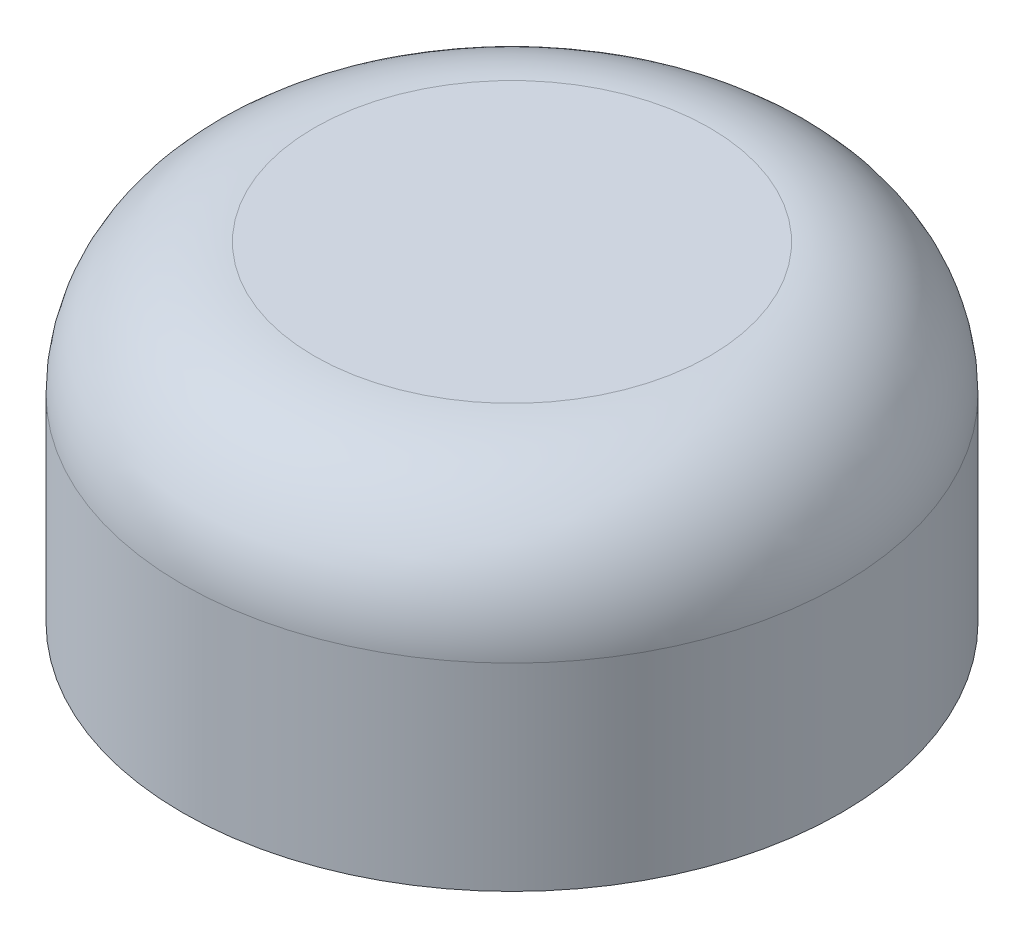
ISO-10303-21;
HEADER;
FILE_DESCRIPTION(('STEP AP214'),'2;1');
FILE_NAME('part.step','',(''),(''),'','','');
FILE_SCHEMA(('AUTOMOTIVE_DESIGN { 1 0 10303 214 1 1 1 1 }'));
ENDSEC;
DATA;
#1=APPLICATION_CONTEXT('core data for automotive mechanical design processes');
#2=APPLICATION_PROTOCOL_DEFINITION('international standard','automotive_design',2000,#1);
#3=PRODUCT_CONTEXT('',#1,'mechanical');
#4=PRODUCT('Part','Part','',(#3));
#5=PRODUCT_RELATED_PRODUCT_CATEGORY('part','',(#4));
#6=PRODUCT_DEFINITION_FORMATION('','',#4);
#7=PRODUCT_DEFINITION_CONTEXT('part definition',#1,'design');
#8=PRODUCT_DEFINITION('design','',#6,#7);
#9=PRODUCT_DEFINITION_SHAPE('','',#8);
#10=(LENGTH_UNIT() NAMED_UNIT(*) SI_UNIT(.MILLI.,.METRE.));
#11=(NAMED_UNIT(*) PLANE_ANGLE_UNIT() SI_UNIT($,.RADIAN.));
#12=(NAMED_UNIT(*) SI_UNIT($,.STERADIAN.) SOLID_ANGLE_UNIT());
#13=UNCERTAINTY_MEASURE_WITH_UNIT(LENGTH_MEASURE(1.E-05),#10,'distance_accuracy_value','');
#14=(GEOMETRIC_REPRESENTATION_CONTEXT(3) GLOBAL_UNCERTAINTY_ASSIGNED_CONTEXT((#13)) GLOBAL_UNIT_ASSIGNED_CONTEXT((#10,
#11,#12)) REPRESENTATION_CONTEXT('',''));
#15=CARTESIAN_POINT('',(0.,0.,0.));
#16=DIRECTION('',(0.,0.,1.));
#17=DIRECTION('',(1.,0.,0.));
#18=AXIS2_PLACEMENT_3D('',#15,#16,#17);
#19=CARTESIAN_POINT('',(53.9551844151387,24.2156806331102,0.));
#20=DIRECTION('',(0.,1.,0.));
#21=DIRECTION('',(0.,0.,1.));
#22=AXIS2_PLACEMENT_3D('',#19,#20,#21);
#23=CYLINDRICAL_SURFACE('',#22,0.5);
#24=CARTESIAN_POINT('',(53.9551844151387,24.0156806331102,0.));
#25=DIRECTION('',(0.,1.,0.));
#26=DIRECTION('',(0.,0.,1.));
#27=AXIS2_PLACEMENT_3D('',#24,#25,#26);
#28=CIRCLE('',#27,0.5);
#29=CARTESIAN_POINT('',(53.9551844151387,24.0156806331102,0.5));
#30=VERTEX_POINT('',#29);
#31=EDGE_CURVE('E10',#30,#30,#28,.T.);
#32=ORIENTED_EDGE('',*,*,#31,.F.);
#33=EDGE_LOOP('',(#32));
#34=FACE_BOUND('',#33,.T.);
#35=CARTESIAN_POINT('',(53.9551844151387,23.7156806331102,0.));
#36=DIRECTION('',(0.,1.,0.));
#37=DIRECTION('',(0.,0.,1.));
#38=AXIS2_PLACEMENT_3D('',#35,#36,#37);
#39=CIRCLE('',#38,0.5);
#40=CARTESIAN_POINT('',(53.9551844151387,23.7156806331102,0.5));
#41=VERTEX_POINT('',#40);
#42=EDGE_CURVE('E41',#41,#41,#39,.T.);
#43=ORIENTED_EDGE('',*,*,#42,.T.);
#44=EDGE_LOOP('',(#43));
#45=FACE_BOUND('',#44,.T.);
#46=ADVANCED_FACE('F31',(#34,#45),#23,.T.);
#47=CARTESIAN_POINT('',(53.9551844151387,24.0156806331102,0.));
#48=DIRECTION('',(0.,1.,0.));
#49=DIRECTION('',(0.,0.,1.));
#50=AXIS2_PLACEMENT_3D('',#47,#48,#49);
#51=TOROIDAL_SURFACE('',#50,0.300000000000002,0.200000000000001);
#52=CARTESIAN_POINT('',(53.9551844151387,24.2156806331102,0.));
#53=DIRECTION('',(0.,1.,0.));
#54=DIRECTION('',(0.,0.,1.));
#55=AXIS2_PLACEMENT_3D('',#52,#53,#54);
#56=CIRCLE('',#55,0.300000000000002);
#57=CARTESIAN_POINT('',(53.9551844151387,24.2156806331102,0.300000000000002));
#58=VERTEX_POINT('',#57);
#59=EDGE_CURVE('E37',#58,#58,#56,.T.);
#60=ORIENTED_EDGE('',*,*,#59,.F.);
#61=EDGE_LOOP('',(#60));
#62=FACE_BOUND('',#61,.T.);
#63=ORIENTED_EDGE('',*,*,#31,.T.);
#64=EDGE_LOOP('',(#63));
#65=FACE_BOUND('',#64,.T.);
#66=ADVANCED_FACE('F56',(#62,#65),#51,.T.);
#67=CARTESIAN_POINT('',(53.9551844151387,24.2156806331102,0.));
#68=DIRECTION('',(0.,-1.,0.));
#69=DIRECTION('',(0.,0.,-1.));
#70=AXIS2_PLACEMENT_3D('',#67,#68,#69);
#71=PLANE('',#70);
#72=ORIENTED_EDGE('',*,*,#59,.T.);
#73=EDGE_LOOP('',(#72));
#74=FACE_BOUND('',#73,.T.);
#75=ADVANCED_FACE('F51',(#74),#71,.F.);
#76=CARTESIAN_POINT('',(53.9551844151387,23.7156806331102,0.));
#77=DIRECTION('',(0.,1.,0.));
#78=DIRECTION('',(0.,0.,1.));
#79=AXIS2_PLACEMENT_3D('',#76,#77,#78);
#80=PLANE('',#79);
#81=ORIENTED_EDGE('',*,*,#42,.F.);
#82=EDGE_LOOP('',(#81));
#83=FACE_BOUND('',#82,.T.);
#84=ADVANCED_FACE('F49',(#83),#80,.F.);
#85=CLOSED_SHELL('',(#46,#66,#75,#84));
#86=MANIFOLD_SOLID_BREP('B2',#85);
#87=ADVANCED_BREP_SHAPE_REPRESENTATION('',(#18,#86),#14);
#88=SHAPE_DEFINITION_REPRESENTATION(#9,#87);
ENDSEC;
END-ISO-10303-21;
